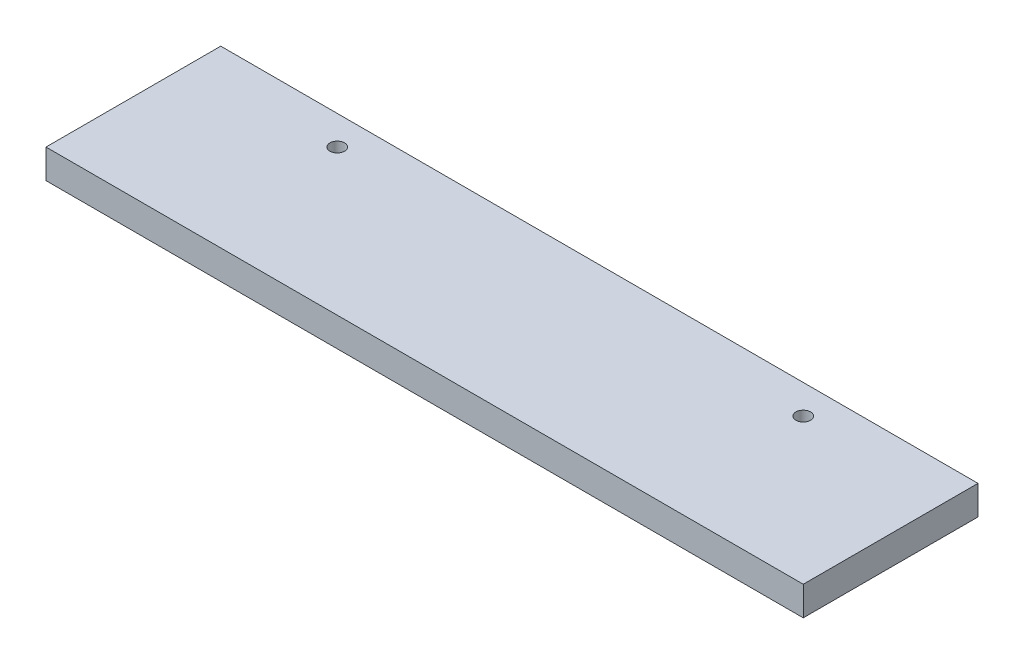
ISO-10303-21;
HEADER;
FILE_DESCRIPTION(('STEP AP214'),'2;1');
FILE_NAME('part.step','',(''),(''),'','','');
FILE_SCHEMA(('AUTOMOTIVE_DESIGN { 1 0 10303 214 1 1 1 1 }'));
ENDSEC;
DATA;
#1=APPLICATION_CONTEXT('core data for automotive mechanical design processes');
#2=APPLICATION_PROTOCOL_DEFINITION('international standard','automotive_design',2000,#1);
#3=PRODUCT_CONTEXT('',#1,'mechanical');
#4=PRODUCT('Part','Part','',(#3));
#5=PRODUCT_RELATED_PRODUCT_CATEGORY('part','',(#4));
#6=PRODUCT_DEFINITION_FORMATION('','',#4);
#7=PRODUCT_DEFINITION_CONTEXT('part definition',#1,'design');
#8=PRODUCT_DEFINITION('design','',#6,#7);
#9=PRODUCT_DEFINITION_SHAPE('','',#8);
#10=(LENGTH_UNIT() NAMED_UNIT(*) SI_UNIT(.MILLI.,.METRE.));
#11=(NAMED_UNIT(*) PLANE_ANGLE_UNIT() SI_UNIT($,.RADIAN.));
#12=(NAMED_UNIT(*) SI_UNIT($,.STERADIAN.) SOLID_ANGLE_UNIT());
#13=UNCERTAINTY_MEASURE_WITH_UNIT(LENGTH_MEASURE(1.E-05),#10,'distance_accuracy_value','');
#14=(GEOMETRIC_REPRESENTATION_CONTEXT(3) GLOBAL_UNCERTAINTY_ASSIGNED_CONTEXT((#13)) GLOBAL_UNIT_ASSIGNED_CONTEXT((#10,
#11,#12)) REPRESENTATION_CONTEXT('',''));
#15=CARTESIAN_POINT('',(0.,0.,0.));
#16=DIRECTION('',(0.,0.,1.));
#17=DIRECTION('',(1.,0.,0.));
#18=AXIS2_PLACEMENT_3D('',#15,#16,#17);
#19=CARTESIAN_POINT('',(0.,3.175,0.));
#20=DIRECTION('',(1.,0.,0.));
#21=DIRECTION('',(0.,0.,-1.));
#22=AXIS2_PLACEMENT_3D('',#19,#20,#21);
#23=PLANE('',#22);
#24=DIRECTION('',(0.,0.,1.));
#25=VECTOR('',#24,1.);
#26=CARTESIAN_POINT('',(0.,0.,0.));
#27=LINE('',#26,#25);
#28=CARTESIAN_POINT('',(0.,0.,-19.05));
#29=VERTEX_POINT('',#28);
#30=CARTESIAN_POINT('',(0.,0.,0.));
#31=VERTEX_POINT('',#30);
#32=EDGE_CURVE('E103',#29,#31,#27,.T.);
#33=ORIENTED_EDGE('',*,*,#32,.T.);
#34=DIRECTION('',(0.,-1.,0.));
#35=VECTOR('',#34,1.);
#36=CARTESIAN_POINT('',(0.,3.175,0.));
#37=LINE('',#36,#35);
#38=CARTESIAN_POINT('',(0.,3.175,0.));
#39=VERTEX_POINT('',#38);
#40=EDGE_CURVE('E11',#39,#31,#37,.T.);
#41=ORIENTED_EDGE('',*,*,#40,.F.);
#42=DIRECTION('',(0.,0.,1.));
#43=VECTOR('',#42,1.);
#44=CARTESIAN_POINT('',(0.,3.175,0.));
#45=LINE('',#44,#43);
#46=CARTESIAN_POINT('',(0.,3.175,-19.05));
#47=VERTEX_POINT('',#46);
#48=EDGE_CURVE('E91',#47,#39,#45,.T.);
#49=ORIENTED_EDGE('',*,*,#48,.F.);
#50=DIRECTION('',(0.,-1.,0.));
#51=VECTOR('',#50,1.);
#52=CARTESIAN_POINT('',(0.,3.175,-19.05));
#53=LINE('',#52,#51);
#54=EDGE_CURVE('E99',#47,#29,#53,.T.);
#55=ORIENTED_EDGE('',*,*,#54,.T.);
#56=EDGE_LOOP('',(#33,#41,#49,#55));
#57=FACE_BOUND('',#56,.T.);
#58=ADVANCED_FACE('F40',(#57),#23,.F.);
#59=CARTESIAN_POINT('',(0.,3.175,0.));
#60=DIRECTION('',(0.,0.,-1.));
#61=DIRECTION('',(-1.,0.,0.));
#62=AXIS2_PLACEMENT_3D('',#59,#60,#61);
#63=PLANE('',#62);
#64=DIRECTION('',(1.,0.,0.));
#65=VECTOR('',#64,1.);
#66=CARTESIAN_POINT('',(0.,0.,0.));
#67=LINE('',#66,#65);
#68=CARTESIAN_POINT('',(82.55,0.,0.));
#69=VERTEX_POINT('',#68);
#70=EDGE_CURVE('E95',#31,#69,#67,.T.);
#71=ORIENTED_EDGE('',*,*,#70,.T.);
#72=DIRECTION('',(0.,-1.,0.));
#73=VECTOR('',#72,1.);
#74=CARTESIAN_POINT('',(82.55,3.175,0.));
#75=LINE('',#74,#73);
#76=CARTESIAN_POINT('',(82.55,3.175,0.));
#77=VERTEX_POINT('',#76);
#78=EDGE_CURVE('E48',#77,#69,#75,.T.);
#79=ORIENTED_EDGE('',*,*,#78,.F.);
#80=DIRECTION('',(1.,0.,0.));
#81=VECTOR('',#80,1.);
#82=CARTESIAN_POINT('',(0.,3.175,0.));
#83=LINE('',#82,#81);
#84=EDGE_CURVE('E86',#39,#77,#83,.T.);
#85=ORIENTED_EDGE('',*,*,#84,.F.);
#86=ORIENTED_EDGE('',*,*,#40,.T.);
#87=EDGE_LOOP('',(#71,#79,#85,#86));
#88=FACE_BOUND('',#87,.T.);
#89=ADVANCED_FACE('F94',(#88),#63,.F.);
#90=CARTESIAN_POINT('',(82.55,3.175,0.));
#91=DIRECTION('',(-1.,0.,0.));
#92=DIRECTION('',(0.,0.,1.));
#93=AXIS2_PLACEMENT_3D('',#90,#91,#92);
#94=PLANE('',#93);
#95=DIRECTION('',(0.,0.,-1.));
#96=VECTOR('',#95,1.);
#97=CARTESIAN_POINT('',(82.55,0.,0.));
#98=LINE('',#97,#96);
#99=CARTESIAN_POINT('',(82.55,0.,-19.05));
#100=VERTEX_POINT('',#99);
#101=EDGE_CURVE('E73',#69,#100,#98,.T.);
#102=ORIENTED_EDGE('',*,*,#101,.T.);
#103=DIRECTION('',(0.,-1.,0.));
#104=VECTOR('',#103,1.);
#105=CARTESIAN_POINT('',(82.55,3.175,-19.05));
#106=LINE('',#105,#104);
#107=CARTESIAN_POINT('',(82.55,3.175,-19.05));
#108=VERTEX_POINT('',#107);
#109=EDGE_CURVE('E96',#108,#100,#106,.T.);
#110=ORIENTED_EDGE('',*,*,#109,.F.);
#111=DIRECTION('',(0.,0.,-1.));
#112=VECTOR('',#111,1.);
#113=CARTESIAN_POINT('',(82.55,3.175,0.));
#114=LINE('',#113,#112);
#115=EDGE_CURVE('E89',#77,#108,#114,.T.);
#116=ORIENTED_EDGE('',*,*,#115,.F.);
#117=ORIENTED_EDGE('',*,*,#78,.T.);
#118=EDGE_LOOP('',(#102,#110,#116,#117));
#119=FACE_BOUND('',#118,.T.);
#120=ADVANCED_FACE('F97',(#119),#94,.F.);
#121=CARTESIAN_POINT('',(0.,3.175,-19.05));
#122=DIRECTION('',(0.,0.,1.));
#123=DIRECTION('',(1.,0.,0.));
#124=AXIS2_PLACEMENT_3D('',#121,#122,#123);
#125=PLANE('',#124);
#126=DIRECTION('',(-1.,0.,0.));
#127=VECTOR('',#126,1.);
#128=CARTESIAN_POINT('',(0.,0.,-19.05));
#129=LINE('',#128,#127);
#130=EDGE_CURVE('E79',#100,#29,#129,.T.);
#131=ORIENTED_EDGE('',*,*,#130,.T.);
#132=ORIENTED_EDGE('',*,*,#54,.F.);
#133=DIRECTION('',(-1.,0.,0.));
#134=VECTOR('',#133,1.);
#135=CARTESIAN_POINT('',(0.,3.175,-19.05));
#136=LINE('',#135,#134);
#137=EDGE_CURVE('E56',#108,#47,#136,.T.);
#138=ORIENTED_EDGE('',*,*,#137,.F.);
#139=ORIENTED_EDGE('',*,*,#109,.T.);
#140=EDGE_LOOP('',(#131,#132,#138,#139));
#141=FACE_BOUND('',#140,.T.);
#142=ADVANCED_FACE('F111',(#141),#125,.F.);
#143=CARTESIAN_POINT('',(0.,3.175,0.));
#144=DIRECTION('',(0.,-1.,0.));
#145=DIRECTION('',(0.,0.,-1.));
#146=AXIS2_PLACEMENT_3D('',#143,#144,#145);
#147=PLANE('',#146);
#148=CARTESIAN_POINT('',(15.875,3.175,-15.875));
#149=DIRECTION('',(0.,1.,0.));
#150=DIRECTION('',(0.,0.,1.));
#151=AXIS2_PLACEMENT_3D('',#148,#149,#150);
#152=CIRCLE('',#151,0.793749999999999);
#153=CARTESIAN_POINT('',(15.875,3.175,-15.08125));
#154=VERTEX_POINT('',#153);
#155=EDGE_CURVE('E123',#154,#154,#152,.T.);
#156=ORIENTED_EDGE('',*,*,#155,.F.);
#157=EDGE_LOOP('',(#156));
#158=FACE_BOUND('',#157,.T.);
#159=CARTESIAN_POINT('',(66.675,3.175,-15.875));
#160=DIRECTION('',(0.,1.,0.));
#161=DIRECTION('',(0.,0.,1.));
#162=AXIS2_PLACEMENT_3D('',#159,#160,#161);
#163=CIRCLE('',#162,0.793749999999993);
#164=CARTESIAN_POINT('',(66.675,3.175,-15.08125));
#165=VERTEX_POINT('',#164);
#166=EDGE_CURVE('E117',#165,#165,#163,.T.);
#167=ORIENTED_EDGE('',*,*,#166,.F.);
#168=EDGE_LOOP('',(#167));
#169=FACE_BOUND('',#168,.T.);
#170=ORIENTED_EDGE('',*,*,#48,.T.);
#171=ORIENTED_EDGE('',*,*,#84,.T.);
#172=ORIENTED_EDGE('',*,*,#115,.T.);
#173=ORIENTED_EDGE('',*,*,#137,.T.);
#174=EDGE_LOOP('',(#170,#171,#172,#173));
#175=FACE_BOUND('',#174,.T.);
#176=ADVANCED_FACE('F87',(#158,#169,#175),#147,.F.);
#177=CARTESIAN_POINT('',(0.,0.,0.));
#178=DIRECTION('',(0.,-1.,0.));
#179=DIRECTION('',(0.,0.,-1.));
#180=AXIS2_PLACEMENT_3D('',#177,#178,#179);
#181=PLANE('',#180);
#182=CARTESIAN_POINT('',(15.875,0.,-15.875));
#183=DIRECTION('',(0.,1.,0.));
#184=DIRECTION('',(0.,0.,1.));
#185=AXIS2_PLACEMENT_3D('',#182,#183,#184);
#186=CIRCLE('',#185,0.793749999999999);
#187=CARTESIAN_POINT('',(15.875,0.,-15.08125));
#188=VERTEX_POINT('',#187);
#189=EDGE_CURVE('E106',#188,#188,#186,.T.);
#190=ORIENTED_EDGE('',*,*,#189,.T.);
#191=EDGE_LOOP('',(#190));
#192=FACE_BOUND('',#191,.T.);
#193=CARTESIAN_POINT('',(66.675,0.,-15.875));
#194=DIRECTION('',(0.,1.,0.));
#195=DIRECTION('',(0.,0.,1.));
#196=AXIS2_PLACEMENT_3D('',#193,#194,#195);
#197=CIRCLE('',#196,0.793749999999993);
#198=CARTESIAN_POINT('',(66.675,0.,-15.08125));
#199=VERTEX_POINT('',#198);
#200=EDGE_CURVE('E120',#199,#199,#197,.T.);
#201=ORIENTED_EDGE('',*,*,#200,.T.);
#202=EDGE_LOOP('',(#201));
#203=FACE_BOUND('',#202,.T.);
#204=ORIENTED_EDGE('',*,*,#32,.F.);
#205=ORIENTED_EDGE('',*,*,#130,.F.);
#206=ORIENTED_EDGE('',*,*,#101,.F.);
#207=ORIENTED_EDGE('',*,*,#70,.F.);
#208=EDGE_LOOP('',(#204,#205,#206,#207));
#209=FACE_BOUND('',#208,.T.);
#210=ADVANCED_FACE('F114',(#192,#203,#209),#181,.T.);
#211=CARTESIAN_POINT('',(66.675,0.,-15.875));
#212=DIRECTION('',(0.,1.,0.));
#213=DIRECTION('',(0.,0.,1.));
#214=AXIS2_PLACEMENT_3D('',#211,#212,#213);
#215=CYLINDRICAL_SURFACE('',#214,0.793749999999993);
#216=ORIENTED_EDGE('',*,*,#200,.F.);
#217=EDGE_LOOP('',(#216));
#218=FACE_BOUND('',#217,.T.);
#219=ORIENTED_EDGE('',*,*,#166,.T.);
#220=EDGE_LOOP('',(#219));
#221=FACE_BOUND('',#220,.T.);
#222=ADVANCED_FACE('F134',(#218,#221),#215,.F.);
#223=CARTESIAN_POINT('',(15.875,0.,-15.875));
#224=DIRECTION('',(0.,1.,0.));
#225=DIRECTION('',(0.,0.,1.));
#226=AXIS2_PLACEMENT_3D('',#223,#224,#225);
#227=CYLINDRICAL_SURFACE('',#226,0.793749999999999);
#228=ORIENTED_EDGE('',*,*,#189,.F.);
#229=EDGE_LOOP('',(#228));
#230=FACE_BOUND('',#229,.T.);
#231=ORIENTED_EDGE('',*,*,#155,.T.);
#232=EDGE_LOOP('',(#231));
#233=FACE_BOUND('',#232,.T.);
#234=ADVANCED_FACE('F131',(#230,#233),#227,.F.);
#235=CLOSED_SHELL('',(#58,#89,#120,#142,#176,#210,#222,#234));
#236=MANIFOLD_SOLID_BREP('B2',#235);
#237=ADVANCED_BREP_SHAPE_REPRESENTATION('',(#18,#236),#14);
#238=SHAPE_DEFINITION_REPRESENTATION(#9,#237);
ENDSEC;
END-ISO-10303-21;
